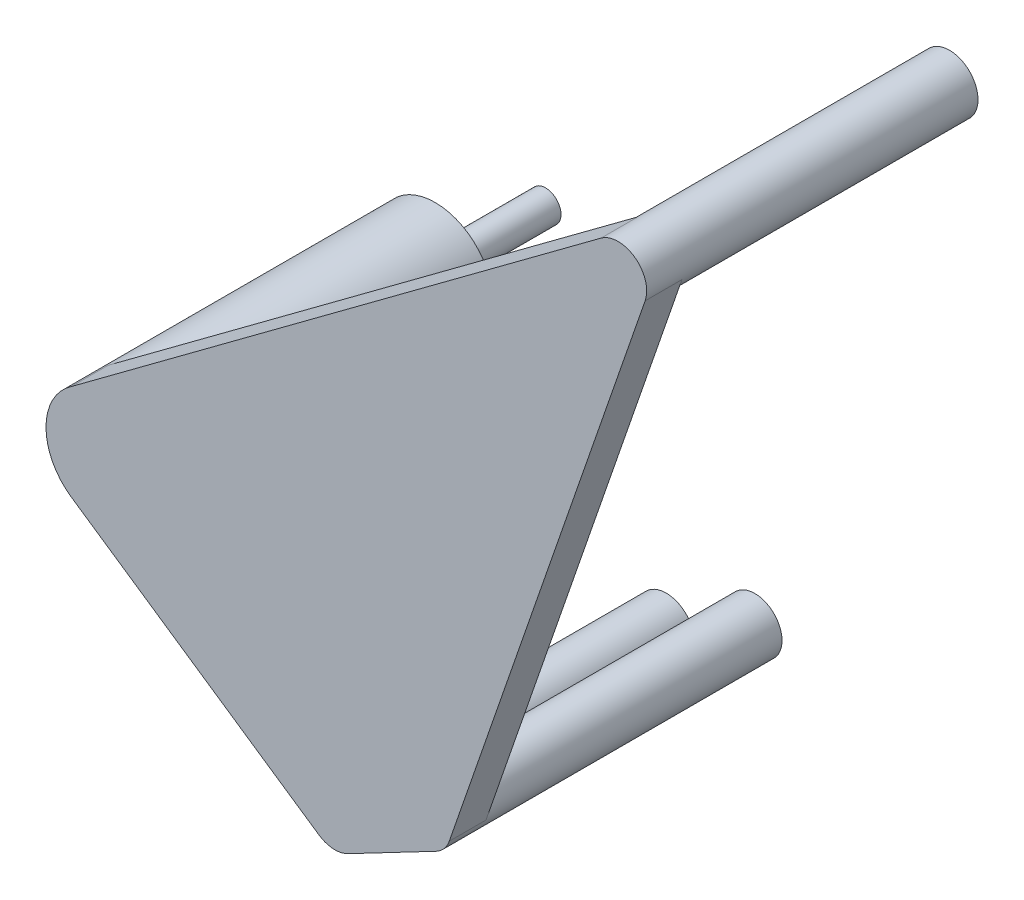
ISO-10303-21;
HEADER;
FILE_DESCRIPTION(('STEP AP214'),'2;1');
FILE_NAME('part.step','',(''),(''),'','','');
FILE_SCHEMA(('AUTOMOTIVE_DESIGN { 1 0 10303 214 1 1 1 1 }'));
ENDSEC;
DATA;
#1=APPLICATION_CONTEXT('core data for automotive mechanical design processes');
#2=APPLICATION_PROTOCOL_DEFINITION('international standard','automotive_design',2000,#1);
#3=PRODUCT_CONTEXT('',#1,'mechanical');
#4=PRODUCT('Part','Part','',(#3));
#5=PRODUCT_RELATED_PRODUCT_CATEGORY('part','',(#4));
#6=PRODUCT_DEFINITION_FORMATION('','',#4);
#7=PRODUCT_DEFINITION_CONTEXT('part definition',#1,'design');
#8=PRODUCT_DEFINITION('design','',#6,#7);
#9=PRODUCT_DEFINITION_SHAPE('','',#8);
#10=(LENGTH_UNIT() NAMED_UNIT(*) SI_UNIT(.MILLI.,.METRE.));
#11=(NAMED_UNIT(*) PLANE_ANGLE_UNIT() SI_UNIT($,.RADIAN.));
#12=(NAMED_UNIT(*) SI_UNIT($,.STERADIAN.) SOLID_ANGLE_UNIT());
#13=UNCERTAINTY_MEASURE_WITH_UNIT(LENGTH_MEASURE(1.E-05),#10,'distance_accuracy_value','');
#14=(GEOMETRIC_REPRESENTATION_CONTEXT(3) GLOBAL_UNCERTAINTY_ASSIGNED_CONTEXT((#13)) GLOBAL_UNIT_ASSIGNED_CONTEXT((#10,
#11,#12)) REPRESENTATION_CONTEXT('',''));
#15=CARTESIAN_POINT('',(0.,0.,0.));
#16=DIRECTION('',(0.,0.,1.));
#17=DIRECTION('',(1.,0.,0.));
#18=AXIS2_PLACEMENT_3D('',#15,#16,#17);
#19=CARTESIAN_POINT('',(0.,0.,35.7505));
#20=DIRECTION('',(0.,0.,1.));
#21=DIRECTION('',(1.,0.,0.));
#22=AXIS2_PLACEMENT_3D('',#19,#20,#21);
#23=PLANE('',#22);
#24=CARTESIAN_POINT('',(-2.84319901034025,123.138021162855,35.7505));
#25=DIRECTION('',(0.,0.,1.));
#26=DIRECTION('',(1.,0.,0.));
#27=AXIS2_PLACEMENT_3D('',#24,#25,#26);
#28=CIRCLE('',#27,7.40503170518328);
#29=CARTESIAN_POINT('',(4.15447512995117,120.715821505298,35.7505));
#30=VERTEX_POINT('',#29);
#31=CARTESIAN_POINT('',(-7.25833485906466,129.082856736029,35.7505));
#32=VERTEX_POINT('',#31);
#33=EDGE_CURVE('E45',#30,#32,#28,.F.);
#34=ORIENTED_EDGE('',*,*,#33,.F.);
#35=DIRECTION('',(0.327101861813902,0.944989085650136,0.));
#36=VECTOR('',#35,1.);
#37=CARTESIAN_POINT('',(-33.6042241942555,11.6318849240364,35.7505));
#38=LINE('',#37,#36);
#39=CARTESIAN_POINT('',(-46.5758038889972,-25.8426839065925,35.7505));
#40=VERTEX_POINT('',#39);
#41=EDGE_CURVE('E128',#40,#30,#38,.T.);
#42=ORIENTED_EDGE('',*,*,#41,.F.);
#43=CARTESIAN_POINT('',(-53.2361349334904,-23.5372533804274,35.7505));
#44=DIRECTION('',(0.,0.,1.));
#45=DIRECTION('',(1.,0.,0.));
#46=AXIS2_PLACEMENT_3D('',#43,#44,#45);
#47=CIRCLE('',#46,7.04805076125397);
#48=CARTESIAN_POINT('',(-49.9662161408965,-29.7808621624583,35.7505));
#49=VERTEX_POINT('',#48);
#50=EDGE_CURVE('E133',#49,#40,#47,.F.);
#51=ORIENTED_EDGE('',*,*,#50,.F.);
#52=DIRECTION('',(0.885863197290606,0.46394654399625,0.));
#53=VECTOR('',#52,1.);
#54=CARTESIAN_POINT('',(1.48468298043132,-2.83486541505193,35.7505));
#55=LINE('',#54,#53);
#56=CARTESIAN_POINT('',(-72.768932332621,-41.7231591257302,35.7505));
#57=VERTEX_POINT('',#56);
#58=EDGE_CURVE('E154',#57,#49,#55,.T.);
#59=ORIENTED_EDGE('',*,*,#58,.F.);
#60=CARTESIAN_POINT('',(-76.1757268505461,-35.2181987521369,35.7505));
#61=DIRECTION('',(0.,0.,1.));
#62=DIRECTION('',(1.,0.,0.));
#63=AXIS2_PLACEMENT_3D('',#60,#61,#62);
#64=CIRCLE('',#63,7.34307553749678);
#65=CARTESIAN_POINT('',(-80.3107623465941,-41.2863318913986,35.7505));
#66=VERTEX_POINT('',#65);
#67=EDGE_CURVE('E182',#66,#57,#64,.F.);
#68=ORIENTED_EDGE('',*,*,#67,.F.);
#69=DIRECTION('',(-0.826374876341027,0.563120381226211,0.));
#70=VECTOR('',#69,1.);
#71=CARTESIAN_POINT('',(-44.6794433362743,-65.5667432629609,35.7505));
#72=LINE('',#71,#70);
#73=CARTESIAN_POINT('',(-144.436770340403,2.41134467383935,35.7505));
#74=VERTEX_POINT('',#73);
#75=EDGE_CURVE('E142',#66,#74,#72,.T.);
#76=ORIENTED_EDGE('',*,*,#75,.T.);
#77=CARTESIAN_POINT('',(-135.98996462201,14.8069678189548,35.7505));
#78=DIRECTION('',(0.,0.,1.));
#79=DIRECTION('',(1.,0.,0.));
#80=AXIS2_PLACEMENT_3D('',#77,#78,#79);
#81=CIRCLE('',#80,15.);
#82=CARTESIAN_POINT('',(-144.436770340403,27.2025909640699,35.7505));
#83=VERTEX_POINT('',#82);
#84=EDGE_CURVE('E179',#74,#83,#81,.T.);
#85=ORIENTED_EDGE('',*,*,#84,.T.);
#86=DIRECTION('',(0.802810279531019,0.596234563808009,0.));
#87=VECTOR('',#86,1.);
#88=CARTESIAN_POINT('',(-64.3675245309122,86.6687600788286,35.7505));
#89=LINE('',#88,#87);
#90=EDGE_CURVE('E131',#83,#32,#89,.T.);
#91=ORIENTED_EDGE('',*,*,#90,.T.);
#92=EDGE_LOOP('',(#34,#42,#51,#59,#68,#76,#85,#91));
#93=FACE_BOUND('',#92,.T.);
#94=ADVANCED_FACE('F41',(#93),#23,.F.);
#95=CARTESIAN_POINT('',(-135.98996462201,14.8069678189548,40.513));
#96=DIRECTION('',(0.,0.,-1.));
#97=DIRECTION('',(-1.,0.,0.));
#98=AXIS2_PLACEMENT_3D('',#95,#96,#97);
#99=CYLINDRICAL_SURFACE('',#98,15.);
#100=ORIENTED_EDGE('',*,*,#84,.F.);
#101=DIRECTION('',(0.,0.,-1.));
#102=VECTOR('',#101,1.);
#103=CARTESIAN_POINT('',(-144.436770340403,2.41134467383935,45.2755));
#104=LINE('',#103,#102);
#105=CARTESIAN_POINT('',(-144.436770340403,2.41134467383935,45.2755));
#106=VERTEX_POINT('',#105);
#107=EDGE_CURVE('E66',#106,#74,#104,.T.);
#108=ORIENTED_EDGE('',*,*,#107,.F.);
#109=CARTESIAN_POINT('',(-135.98996462201,14.8069678189548,45.2755));
#110=DIRECTION('',(0.,0.,1.));
#111=DIRECTION('',(1.,0.,0.));
#112=AXIS2_PLACEMENT_3D('',#109,#110,#111);
#113=CIRCLE('',#112,15.);
#114=CARTESIAN_POINT('',(-144.436770340403,27.2025909640699,45.2755));
#115=VERTEX_POINT('',#114);
#116=EDGE_CURVE('E208',#115,#106,#113,.T.);
#117=ORIENTED_EDGE('',*,*,#116,.F.);
#118=DIRECTION('',(0.,0.,-1.));
#119=VECTOR('',#118,1.);
#120=CARTESIAN_POINT('',(-144.436770340403,27.2025909640699,45.2755));
#121=LINE('',#120,#119);
#122=EDGE_CURVE('E58',#115,#83,#121,.T.);
#123=ORIENTED_EDGE('',*,*,#122,.T.);
#124=EDGE_LOOP('',(#100,#108,#117,#123));
#125=FACE_BOUND('',#124,.T.);
#126=CARTESIAN_POINT('',(-135.98996462201,14.8069678189548,-40.513));
#127=DIRECTION('',(0.,0.,1.));
#128=DIRECTION('',(1.,0.,0.));
#129=AXIS2_PLACEMENT_3D('',#126,#127,#128);
#130=CIRCLE('',#129,15.);
#131=CARTESIAN_POINT('',(-120.98996462201,14.8069678189548,-40.513));
#132=VERTEX_POINT('',#131);
#133=EDGE_CURVE('E122',#132,#132,#130,.T.);
#134=ORIENTED_EDGE('',*,*,#133,.T.);
#135=EDGE_LOOP('',(#134));
#136=FACE_BOUND('',#135,.T.);
#137=ADVANCED_FACE('F43',(#125,#136),#99,.T.);
#138=CARTESIAN_POINT('',(0.,0.,-40.513));
#139=DIRECTION('',(0.,0.,1.));
#140=DIRECTION('',(1.,0.,0.));
#141=AXIS2_PLACEMENT_3D('',#138,#139,#140);
#142=PLANE('',#141);
#143=CARTESIAN_POINT('',(-135.98996462201,14.8069678189548,-40.513));
#144=DIRECTION('',(0.,0.,-1.));
#145=DIRECTION('',(-1.,0.,0.));
#146=AXIS2_PLACEMENT_3D('',#143,#144,#145);
#147=CIRCLE('',#146,3.99999999999999);
#148=CARTESIAN_POINT('',(-139.98996462201,14.8069678189548,-40.513));
#149=VERTEX_POINT('',#148);
#150=EDGE_CURVE('E11',#149,#149,#147,.T.);
#151=ORIENTED_EDGE('',*,*,#150,.F.);
#152=EDGE_LOOP('',(#151));
#153=FACE_BOUND('',#152,.T.);
#154=ORIENTED_EDGE('',*,*,#133,.F.);
#155=EDGE_LOOP('',(#154));
#156=FACE_BOUND('',#155,.T.);
#157=ADVANCED_FACE('F231',(#153,#156),#142,.F.);
#158=CARTESIAN_POINT('',(-33.6042241942555,11.6318849240364,45.2755));
#159=DIRECTION('',(-0.944989085650135,0.327101861813902,0.));
#160=DIRECTION('',(-0.327101861813902,-0.944989085650136,0.));
#161=AXIS2_PLACEMENT_3D('',#158,#159,#160);
#162=PLANE('',#161);
#163=ORIENTED_EDGE('',*,*,#41,.T.);
#164=DIRECTION('',(0.,0.,-1.));
#165=VECTOR('',#164,1.);
#166=CARTESIAN_POINT('',(4.15447512995117,120.715821505298,45.2755));
#167=LINE('',#166,#165);
#168=CARTESIAN_POINT('',(4.15447512995117,120.715821505298,45.2755));
#169=VERTEX_POINT('',#168);
#170=EDGE_CURVE('E110',#169,#30,#167,.T.);
#171=ORIENTED_EDGE('',*,*,#170,.F.);
#172=DIRECTION('',(0.327101861813902,0.944989085650136,0.));
#173=VECTOR('',#172,1.);
#174=CARTESIAN_POINT('',(-33.6042241942555,11.6318849240364,45.2755));
#175=LINE('',#174,#173);
#176=CARTESIAN_POINT('',(-46.5758038889972,-25.8426839065925,45.2755));
#177=VERTEX_POINT('',#176);
#178=EDGE_CURVE('E158',#177,#169,#175,.T.);
#179=ORIENTED_EDGE('',*,*,#178,.F.);
#180=DIRECTION('',(0.,0.,-1.));
#181=VECTOR('',#180,1.);
#182=CARTESIAN_POINT('',(-46.5758038889972,-25.8426839065925,45.2755));
#183=LINE('',#182,#181);
#184=EDGE_CURVE('E136',#177,#40,#183,.T.);
#185=ORIENTED_EDGE('',*,*,#184,.T.);
#186=EDGE_LOOP('',(#163,#171,#179,#185));
#187=FACE_BOUND('',#186,.T.);
#188=ADVANCED_FACE('F134',(#187),#162,.F.);
#189=CARTESIAN_POINT('',(-2.84319901034025,123.138021162855,45.2755));
#190=DIRECTION('',(0.,0.,-1.));
#191=DIRECTION('',(-1.,0.,0.));
#192=AXIS2_PLACEMENT_3D('',#189,#190,#191);
#193=CYLINDRICAL_SURFACE('',#192,7.40503170518327);
#194=ORIENTED_EDGE('',*,*,#170,.T.);
#195=ORIENTED_EDGE('',*,*,#33,.T.);
#196=DIRECTION('',(0.,0.,-1.));
#197=VECTOR('',#196,1.);
#198=CARTESIAN_POINT('',(-7.25833485906466,129.082856736029,45.2755));
#199=LINE('',#198,#197);
#200=CARTESIAN_POINT('',(-7.25833485906466,129.082856736029,45.2755));
#201=VERTEX_POINT('',#200);
#202=EDGE_CURVE('E123',#201,#32,#199,.T.);
#203=ORIENTED_EDGE('',*,*,#202,.F.);
#204=CARTESIAN_POINT('',(-2.84319901034025,123.138021162855,45.2755));
#205=DIRECTION('',(0.,0.,1.));
#206=DIRECTION('',(1.,0.,0.));
#207=AXIS2_PLACEMENT_3D('',#204,#205,#206);
#208=CIRCLE('',#207,7.40503170518327);
#209=EDGE_CURVE('E116',#169,#201,#208,.T.);
#210=ORIENTED_EDGE('',*,*,#209,.F.);
#211=EDGE_LOOP('',(#194,#195,#203,#210));
#212=FACE_BOUND('',#211,.T.);
#213=CARTESIAN_POINT('',(-2.84319901034025,123.138021162855,-40.513));
#214=DIRECTION('',(0.,0.,1.));
#215=DIRECTION('',(1.,0.,0.));
#216=AXIS2_PLACEMENT_3D('',#213,#214,#215);
#217=CIRCLE('',#216,7.40503170518328);
#218=CARTESIAN_POINT('',(4.56183269484303,123.138021162855,-40.513));
#219=VERTEX_POINT('',#218);
#220=EDGE_CURVE('E497',#219,#219,#217,.T.);
#221=ORIENTED_EDGE('',*,*,#220,.T.);
#222=EDGE_LOOP('',(#221));
#223=FACE_BOUND('',#222,.T.);
#224=ADVANCED_FACE('F112',(#212,#223),#193,.T.);
#225=CARTESIAN_POINT('',(-64.3675245309122,86.6687600788286,45.2755));
#226=DIRECTION('',(-0.596234563808009,0.802810279531019,0.));
#227=DIRECTION('',(-0.802810279531019,-0.596234563808009,0.));
#228=AXIS2_PLACEMENT_3D('',#225,#226,#227);
#229=PLANE('',#228);
#230=ORIENTED_EDGE('',*,*,#90,.F.);
#231=ORIENTED_EDGE('',*,*,#122,.F.);
#232=DIRECTION('',(0.802810279531019,0.596234563808009,0.));
#233=VECTOR('',#232,1.);
#234=CARTESIAN_POINT('',(-64.3675245309122,86.6687600788286,45.2755));
#235=LINE('',#234,#233);
#236=EDGE_CURVE('E213',#115,#201,#235,.T.);
#237=ORIENTED_EDGE('',*,*,#236,.T.);
#238=ORIENTED_EDGE('',*,*,#202,.T.);
#239=EDGE_LOOP('',(#230,#231,#237,#238));
#240=FACE_BOUND('',#239,.T.);
#241=ADVANCED_FACE('F228',(#240),#229,.T.);
#242=CARTESIAN_POINT('',(-44.6794433362743,-65.5667432629609,45.2755));
#243=DIRECTION('',(-0.563120381226211,-0.826374876341027,0.));
#244=DIRECTION('',(0.826374876341027,-0.563120381226211,0.));
#245=AXIS2_PLACEMENT_3D('',#242,#243,#244);
#246=PLANE('',#245);
#247=ORIENTED_EDGE('',*,*,#75,.F.);
#248=DIRECTION('',(0.,0.,-1.));
#249=VECTOR('',#248,1.);
#250=CARTESIAN_POINT('',(-80.3107623465941,-41.2863318913986,45.2755));
#251=LINE('',#250,#249);
#252=CARTESIAN_POINT('',(-80.3107623465941,-41.2863318913986,45.2755));
#253=VERTEX_POINT('',#252);
#254=EDGE_CURVE('E167',#253,#66,#251,.T.);
#255=ORIENTED_EDGE('',*,*,#254,.F.);
#256=DIRECTION('',(-0.826374876341027,0.563120381226211,0.));
#257=VECTOR('',#256,1.);
#258=CARTESIAN_POINT('',(-44.6794433362743,-65.5667432629609,45.2755));
#259=LINE('',#258,#257);
#260=EDGE_CURVE('E205',#253,#106,#259,.T.);
#261=ORIENTED_EDGE('',*,*,#260,.T.);
#262=ORIENTED_EDGE('',*,*,#107,.T.);
#263=EDGE_LOOP('',(#247,#255,#261,#262));
#264=FACE_BOUND('',#263,.T.);
#265=ADVANCED_FACE('F204',(#264),#246,.T.);
#266=CARTESIAN_POINT('',(-76.1757268505461,-35.2181987521369,45.2755));
#267=DIRECTION('',(0.,0.,-1.));
#268=DIRECTION('',(-1.,0.,0.));
#269=AXIS2_PLACEMENT_3D('',#266,#267,#268);
#270=CYLINDRICAL_SURFACE('',#269,7.3430755374968);
#271=ORIENTED_EDGE('',*,*,#254,.T.);
#272=ORIENTED_EDGE('',*,*,#67,.T.);
#273=DIRECTION('',(0.,0.,-1.));
#274=VECTOR('',#273,1.);
#275=CARTESIAN_POINT('',(-72.768932332621,-41.7231591257302,45.2755));
#276=LINE('',#275,#274);
#277=CARTESIAN_POINT('',(-72.768932332621,-41.7231591257302,45.2755));
#278=VERTEX_POINT('',#277);
#279=EDGE_CURVE('E164',#278,#57,#276,.T.);
#280=ORIENTED_EDGE('',*,*,#279,.F.);
#281=CARTESIAN_POINT('',(-76.1757268505461,-35.2181987521369,45.2755));
#282=DIRECTION('',(0.,0.,1.));
#283=DIRECTION('',(1.,0.,0.));
#284=AXIS2_PLACEMENT_3D('',#281,#282,#283);
#285=CIRCLE('',#284,7.3430755374968);
#286=EDGE_CURVE('E202',#253,#278,#285,.T.);
#287=ORIENTED_EDGE('',*,*,#286,.F.);
#288=EDGE_LOOP('',(#271,#272,#280,#287));
#289=FACE_BOUND('',#288,.T.);
#290=CARTESIAN_POINT('',(-76.1757268505461,-35.2181987521369,-40.513));
#291=DIRECTION('',(0.,0.,1.));
#292=DIRECTION('',(1.,0.,0.));
#293=AXIS2_PLACEMENT_3D('',#290,#291,#292);
#294=CIRCLE('',#293,7.34307553749678);
#295=CARTESIAN_POINT('',(-68.8326513130493,-35.2181987521369,-40.513));
#296=VERTEX_POINT('',#295);
#297=EDGE_CURVE('E138',#296,#296,#294,.T.);
#298=ORIENTED_EDGE('',*,*,#297,.T.);
#299=EDGE_LOOP('',(#298));
#300=FACE_BOUND('',#299,.T.);
#301=ADVANCED_FACE('F200',(#289,#300),#270,.T.);
#302=CARTESIAN_POINT('',(1.48468298043132,-2.83486541505193,45.2755));
#303=DIRECTION('',(-0.46394654399625,0.885863197290606,0.));
#304=DIRECTION('',(-0.885863197290606,-0.46394654399625,0.));
#305=AXIS2_PLACEMENT_3D('',#302,#303,#304);
#306=PLANE('',#305);
#307=ORIENTED_EDGE('',*,*,#58,.T.);
#308=DIRECTION('',(0.,0.,-1.));
#309=VECTOR('',#308,1.);
#310=CARTESIAN_POINT('',(-49.9662161408965,-29.7808621624583,45.2755));
#311=LINE('',#310,#309);
#312=CARTESIAN_POINT('',(-49.9662161408965,-29.7808621624583,45.2755));
#313=VERTEX_POINT('',#312);
#314=EDGE_CURVE('E161',#313,#49,#311,.T.);
#315=ORIENTED_EDGE('',*,*,#314,.F.);
#316=DIRECTION('',(0.885863197290606,0.46394654399625,0.));
#317=VECTOR('',#316,1.);
#318=CARTESIAN_POINT('',(1.48468298043132,-2.83486541505193,45.2755));
#319=LINE('',#318,#317);
#320=EDGE_CURVE('E197',#278,#313,#319,.T.);
#321=ORIENTED_EDGE('',*,*,#320,.F.);
#322=ORIENTED_EDGE('',*,*,#279,.T.);
#323=EDGE_LOOP('',(#307,#315,#321,#322));
#324=FACE_BOUND('',#323,.T.);
#325=ADVANCED_FACE('F194',(#324),#306,.F.);
#326=CARTESIAN_POINT('',(-53.2361349334904,-23.5372533804274,45.2755));
#327=DIRECTION('',(0.,0.,-1.));
#328=DIRECTION('',(-1.,0.,0.));
#329=AXIS2_PLACEMENT_3D('',#326,#327,#328);
#330=CYLINDRICAL_SURFACE('',#329,7.04805076125397);
#331=ORIENTED_EDGE('',*,*,#314,.T.);
#332=ORIENTED_EDGE('',*,*,#50,.T.);
#333=ORIENTED_EDGE('',*,*,#184,.F.);
#334=CARTESIAN_POINT('',(-53.2361349334904,-23.5372533804274,45.2755));
#335=DIRECTION('',(0.,0.,1.));
#336=DIRECTION('',(1.,0.,0.));
#337=AXIS2_PLACEMENT_3D('',#334,#335,#336);
#338=CIRCLE('',#337,7.04805076125397);
#339=EDGE_CURVE('E148',#313,#177,#338,.T.);
#340=ORIENTED_EDGE('',*,*,#339,.F.);
#341=EDGE_LOOP('',(#331,#332,#333,#340));
#342=FACE_BOUND('',#341,.T.);
#343=CARTESIAN_POINT('',(-53.2361349334904,-23.5372533804274,-40.513));
#344=DIRECTION('',(0.,0.,1.));
#345=DIRECTION('',(1.,0.,0.));
#346=AXIS2_PLACEMENT_3D('',#343,#344,#345);
#347=CIRCLE('',#346,7.04805076125397);
#348=CARTESIAN_POINT('',(-46.1880841722364,-23.5372533804274,-40.513));
#349=VERTEX_POINT('',#348);
#350=EDGE_CURVE('E145',#349,#349,#347,.T.);
#351=ORIENTED_EDGE('',*,*,#350,.T.);
#352=EDGE_LOOP('',(#351));
#353=FACE_BOUND('',#352,.T.);
#354=ADVANCED_FACE('F187',(#342,#353),#330,.T.);
#355=CARTESIAN_POINT('',(0.,0.,45.2755));
#356=DIRECTION('',(0.,0.,1.));
#357=DIRECTION('',(1.,0.,0.));
#358=AXIS2_PLACEMENT_3D('',#355,#356,#357);
#359=PLANE('',#358);
#360=ORIENTED_EDGE('',*,*,#178,.T.);
#361=ORIENTED_EDGE('',*,*,#209,.T.);
#362=ORIENTED_EDGE('',*,*,#236,.F.);
#363=ORIENTED_EDGE('',*,*,#116,.T.);
#364=ORIENTED_EDGE('',*,*,#260,.F.);
#365=ORIENTED_EDGE('',*,*,#286,.T.);
#366=ORIENTED_EDGE('',*,*,#320,.T.);
#367=ORIENTED_EDGE('',*,*,#339,.T.);
#368=EDGE_LOOP('',(#360,#361,#362,#363,#364,#365,#366,#367));
#369=FACE_BOUND('',#368,.T.);
#370=ADVANCED_FACE('F218',(#369),#359,.T.);
#371=CARTESIAN_POINT('',(0.,0.,-40.513));
#372=DIRECTION('',(0.,0.,1.));
#373=DIRECTION('',(1.,0.,0.));
#374=AXIS2_PLACEMENT_3D('',#371,#372,#373);
#375=PLANE('',#374);
#376=CARTESIAN_POINT('',(-76.1757268505461,-35.2181987521369,-40.513));
#377=DIRECTION('',(0.,0.,-1.));
#378=DIRECTION('',(-1.,0.,0.));
#379=AXIS2_PLACEMENT_3D('',#376,#377,#378);
#380=CIRCLE('',#379,1.26999999999999);
#381=CARTESIAN_POINT('',(-77.4457268505461,-35.2181987521369,-40.513));
#382=VERTEX_POINT('',#381);
#383=EDGE_CURVE('E486',#382,#382,#380,.T.);
#384=ORIENTED_EDGE('',*,*,#383,.F.);
#385=EDGE_LOOP('',(#384));
#386=FACE_BOUND('',#385,.T.);
#387=ORIENTED_EDGE('',*,*,#297,.F.);
#388=EDGE_LOOP('',(#387));
#389=FACE_BOUND('',#388,.T.);
#390=ADVANCED_FACE('F289',(#386,#389),#375,.F.);
#391=CARTESIAN_POINT('',(0.,0.,-40.513));
#392=DIRECTION('',(0.,0.,1.));
#393=DIRECTION('',(1.,0.,0.));
#394=AXIS2_PLACEMENT_3D('',#391,#392,#393);
#395=PLANE('',#394);
#396=CARTESIAN_POINT('',(-53.2361349334904,-23.5372533804274,-40.513));
#397=DIRECTION('',(0.,0.,-1.));
#398=DIRECTION('',(-1.,0.,0.));
#399=AXIS2_PLACEMENT_3D('',#396,#397,#398);
#400=CIRCLE('',#399,1.27);
#401=CARTESIAN_POINT('',(-54.5061349334904,-23.5372533804274,-40.513));
#402=VERTEX_POINT('',#401);
#403=EDGE_CURVE('E485',#402,#402,#400,.T.);
#404=ORIENTED_EDGE('',*,*,#403,.F.);
#405=EDGE_LOOP('',(#404));
#406=FACE_BOUND('',#405,.T.);
#407=ORIENTED_EDGE('',*,*,#350,.F.);
#408=EDGE_LOOP('',(#407));
#409=FACE_BOUND('',#408,.T.);
#410=ADVANCED_FACE('F295',(#406,#409),#395,.F.);
#411=CARTESIAN_POINT('',(0.,0.,-40.513));
#412=DIRECTION('',(0.,0.,1.));
#413=DIRECTION('',(1.,0.,0.));
#414=AXIS2_PLACEMENT_3D('',#411,#412,#413);
#415=PLANE('',#414);
#416=CARTESIAN_POINT('',(-2.84319901034025,123.138021162855,-40.513));
#417=DIRECTION('',(0.,0.,-1.));
#418=DIRECTION('',(-1.,0.,0.));
#419=AXIS2_PLACEMENT_3D('',#416,#417,#418);
#420=CIRCLE('',#419,1.27);
#421=CARTESIAN_POINT('',(-4.11319901034025,123.138021162855,-40.513));
#422=VERTEX_POINT('',#421);
#423=EDGE_CURVE('E474',#422,#422,#420,.T.);
#424=ORIENTED_EDGE('',*,*,#423,.F.);
#425=EDGE_LOOP('',(#424));
#426=FACE_BOUND('',#425,.T.);
#427=ORIENTED_EDGE('',*,*,#220,.F.);
#428=EDGE_LOOP('',(#427));
#429=FACE_BOUND('',#428,.T.);
#430=ADVANCED_FACE('F302',(#426,#429),#415,.F.);
#431=CARTESIAN_POINT('',(-2.84319901034025,123.138021162855,-30.988));
#432=DIRECTION('',(0.,0.,-1.));
#433=DIRECTION('',(-1.,0.,0.));
#434=AXIS2_PLACEMENT_3D('',#431,#432,#433);
#435=CYLINDRICAL_SURFACE('',#434,1.27);
#436=CARTESIAN_POINT('',(-2.84319901034025,123.138021162855,-30.988));
#437=DIRECTION('',(0.,0.,-1.));
#438=DIRECTION('',(-1.,0.,0.));
#439=AXIS2_PLACEMENT_3D('',#436,#437,#438);
#440=CIRCLE('',#439,1.27);
#441=CARTESIAN_POINT('',(-4.11319901034025,123.138021162855,-30.988));
#442=VERTEX_POINT('',#441);
#443=EDGE_CURVE('E478',#442,#442,#440,.T.);
#444=CARTESIAN_POINT('',(-4.11319901034025,123.138021162855,-30.988));
#445=CARTESIAN_POINT('',(-4.11319901034025,123.138021162855,-31.08721875));
#446=CARTESIAN_POINT('',(-4.11319901034025,123.138021162855,-31.1864375));
#447=CARTESIAN_POINT('',(-4.11319901034025,123.138021162855,-31.384875));
#448=CARTESIAN_POINT('',(-4.11319901034025,123.138021162855,-31.48409375));
#449=CARTESIAN_POINT('',(-4.11319901034025,123.138021162855,-31.68253125));
#450=CARTESIAN_POINT('',(-4.11319901034025,123.138021162855,-31.78175));
#451=CARTESIAN_POINT('',(-4.11319901034025,123.138021162855,-31.9801875));
#452=CARTESIAN_POINT('',(-4.11319901034025,123.138021162855,-32.07940625));
#453=CARTESIAN_POINT('',(-4.11319901034025,123.138021162855,-32.27784375));
#454=CARTESIAN_POINT('',(-4.11319901034025,123.138021162855,-32.3770625));
#455=CARTESIAN_POINT('',(-4.11319901034025,123.138021162855,-32.5755));
#456=CARTESIAN_POINT('',(-4.11319901034025,123.138021162855,-32.67471875));
#457=CARTESIAN_POINT('',(-4.11319901034025,123.138021162855,-32.87315625));
#458=CARTESIAN_POINT('',(-4.11319901034025,123.138021162855,-32.972375));
#459=CARTESIAN_POINT('',(-4.11319901034025,123.138021162855,-33.1708125));
#460=CARTESIAN_POINT('',(-4.11319901034025,123.138021162855,-33.27003125));
#461=CARTESIAN_POINT('',(-4.11319901034025,123.138021162855,-33.46846875));
#462=CARTESIAN_POINT('',(-4.11319901034025,123.138021162855,-33.5676875));
#463=CARTESIAN_POINT('',(-4.11319901034025,123.138021162855,-33.766125));
#464=CARTESIAN_POINT('',(-4.11319901034025,123.138021162855,-33.86534375));
#465=CARTESIAN_POINT('',(-4.11319901034025,123.138021162855,-34.06378125));
#466=CARTESIAN_POINT('',(-4.11319901034025,123.138021162855,-34.163));
#467=CARTESIAN_POINT('',(-4.11319901034025,123.138021162855,-34.3614375));
#468=CARTESIAN_POINT('',(-4.11319901034025,123.138021162855,-34.46065625));
#469=CARTESIAN_POINT('',(-4.11319901034025,123.138021162855,-34.65909375));
#470=CARTESIAN_POINT('',(-4.11319901034025,123.138021162855,-34.7583125));
#471=CARTESIAN_POINT('',(-4.11319901034025,123.138021162855,-34.95675));
#472=CARTESIAN_POINT('',(-4.11319901034025,123.138021162855,-35.05596875));
#473=CARTESIAN_POINT('',(-4.11319901034025,123.138021162855,-35.25440625));
#474=CARTESIAN_POINT('',(-4.11319901034025,123.138021162855,-35.353625));
#475=CARTESIAN_POINT('',(-4.11319901034025,123.138021162855,-35.5520625));
#476=CARTESIAN_POINT('',(-4.11319901034025,123.138021162855,-35.65128125));
#477=CARTESIAN_POINT('',(-4.11319901034025,123.138021162855,-35.84971875));
#478=CARTESIAN_POINT('',(-4.11319901034025,123.138021162855,-35.9489375));
#479=CARTESIAN_POINT('',(-4.11319901034025,123.138021162855,-36.147375));
#480=CARTESIAN_POINT('',(-4.11319901034025,123.138021162855,-36.24659375));
#481=CARTESIAN_POINT('',(-4.11319901034025,123.138021162855,-36.44503125));
#482=CARTESIAN_POINT('',(-4.11319901034025,123.138021162855,-36.54425));
#483=CARTESIAN_POINT('',(-4.11319901034025,123.138021162855,-36.7426875));
#484=CARTESIAN_POINT('',(-4.11319901034025,123.138021162855,-36.84190625));
#485=CARTESIAN_POINT('',(-4.11319901034025,123.138021162855,-37.04034375));
#486=CARTESIAN_POINT('',(-4.11319901034025,123.138021162855,-37.1395625));
#487=CARTESIAN_POINT('',(-4.11319901034025,123.138021162855,-37.338));
#488=CARTESIAN_POINT('',(-4.11319901034025,123.138021162855,-37.43721875));
#489=CARTESIAN_POINT('',(-4.11319901034025,123.138021162855,-37.63565625));
#490=CARTESIAN_POINT('',(-4.11319901034025,123.138021162855,-37.734875));
#491=CARTESIAN_POINT('',(-4.11319901034025,123.138021162855,-37.9333125));
#492=CARTESIAN_POINT('',(-4.11319901034025,123.138021162855,-38.03253125));
#493=CARTESIAN_POINT('',(-4.11319901034025,123.138021162855,-38.23096875));
#494=CARTESIAN_POINT('',(-4.11319901034025,123.138021162855,-38.3301875));
#495=CARTESIAN_POINT('',(-4.11319901034025,123.138021162855,-38.528625));
#496=CARTESIAN_POINT('',(-4.11319901034025,123.138021162855,-38.62784375));
#497=CARTESIAN_POINT('',(-4.11319901034025,123.138021162855,-38.82628125));
#498=CARTESIAN_POINT('',(-4.11319901034025,123.138021162855,-38.9255));
#499=CARTESIAN_POINT('',(-4.11319901034025,123.138021162855,-39.1239375));
#500=CARTESIAN_POINT('',(-4.11319901034025,123.138021162855,-39.22315625));
#501=CARTESIAN_POINT('',(-4.11319901034025,123.138021162855,-39.42159375));
#502=CARTESIAN_POINT('',(-4.11319901034025,123.138021162855,-39.5208125));
#503=CARTESIAN_POINT('',(-4.11319901034025,123.138021162855,-39.71925));
#504=CARTESIAN_POINT('',(-4.11319901034025,123.138021162855,-39.81846875));
#505=CARTESIAN_POINT('',(-4.11319901034025,123.138021162855,-40.01690625));
#506=CARTESIAN_POINT('',(-4.11319901034025,123.138021162855,-40.116125));
#507=CARTESIAN_POINT('',(-4.11319901034025,123.138021162855,-40.3145625));
#508=CARTESIAN_POINT('',(-4.11319901034025,123.138021162855,-40.41378125));
#509=CARTESIAN_POINT('',(-4.11319901034025,123.138021162855,-40.513));
#510=B_SPLINE_CURVE_WITH_KNOTS('',3,(#444,#445,#446,#447,#448,#449,#450,#451,#452,#453,#454,
#455,#456,#457,#458,#459,#460,#461,#462,#463,#464,#465,#466,#467,#468,#469,#470,#471,#472,#473,
#474,#475,#476,#477,#478,#479,#480,#481,#482,#483,#484,#485,#486,#487,#488,#489,#490,#491,#492,
#493,#494,#495,#496,#497,#498,#499,#500,#501,#502,#503,#504,#505,#506,#507,#508,#509),
.UNSPECIFIED.,.F.,.F.,(4,2,2,2,2,2,2,2,2,2,2,2,2,2,2,2,2,2,2,2,2,2,2,2,2,2,2,2,2,2,2,2,4),(0.,
0.297656250000004,0.595312500000004,0.892968750000004,1.190625,1.48828125,1.7859375,2.08359375,
2.38125,2.67890625000001,2.9765625,3.27421875,3.571875,3.86953125,4.1671875,4.46484375,4.7625,
5.06015625,5.3578125,5.65546875,5.953125,6.25078125,6.5484375,6.84609375,7.14375,7.44140625,
7.7390625,8.03671875,8.334375,8.63203125,8.9296875,9.22734375,9.525),.UNSPECIFIED.);
#511=EDGE_CURVE('BSEAM310',#442,#422,#510,.T.);
#512=ORIENTED_EDGE('',*,*,#443,.F.);
#513=ORIENTED_EDGE('',*,*,#423,.T.);
#514=ORIENTED_EDGE('',*,*,#511,.T.);
#515=ORIENTED_EDGE('',*,*,#511,.F.);
#516=EDGE_LOOP('',(#512,#514,#513,#515));
#517=FACE_BOUND('',#516,.T.);
#518=ADVANCED_FACE('F310',(#517),#435,.F.);
#519=CARTESIAN_POINT('',(-2.84319901034025,123.138021162855,-30.988));
#520=DIRECTION('',(0.,0.,-1.));
#521=DIRECTION('',(-1.,0.,0.));
#522=AXIS2_PLACEMENT_3D('',#519,#520,#521);
#523=PLANE('',#522);
#524=ORIENTED_EDGE('',*,*,#443,.T.);
#525=EDGE_LOOP('',(#524));
#526=FACE_BOUND('',#525,.T.);
#527=ADVANCED_FACE('F318',(#526),#523,.T.);
#528=CARTESIAN_POINT('',(-53.2361349334904,-23.5372533804274,-30.988));
#529=DIRECTION('',(0.,0.,-1.));
#530=DIRECTION('',(-1.,0.,0.));
#531=AXIS2_PLACEMENT_3D('',#528,#529,#530);
#532=CYLINDRICAL_SURFACE('',#531,1.27);
#533=CARTESIAN_POINT('',(-53.2361349334904,-23.5372533804274,-30.988));
#534=DIRECTION('',(0.,0.,-1.));
#535=DIRECTION('',(-1.,0.,0.));
#536=AXIS2_PLACEMENT_3D('',#533,#534,#535);
#537=CIRCLE('',#536,1.27);
#538=CARTESIAN_POINT('',(-54.5061349334904,-23.5372533804274,-30.988));
#539=VERTEX_POINT('',#538);
#540=EDGE_CURVE('E493',#539,#539,#537,.T.);
#541=CARTESIAN_POINT('',(-54.5061349334904,-23.5372533804274,-30.988));
#542=CARTESIAN_POINT('',(-54.5061349334904,-23.5372533804274,-31.08721875));
#543=CARTESIAN_POINT('',(-54.5061349334904,-23.5372533804274,-31.1864375));
#544=CARTESIAN_POINT('',(-54.5061349334904,-23.5372533804274,-31.384875));
#545=CARTESIAN_POINT('',(-54.5061349334904,-23.5372533804274,-31.48409375));
#546=CARTESIAN_POINT('',(-54.5061349334904,-23.5372533804274,-31.68253125));
#547=CARTESIAN_POINT('',(-54.5061349334904,-23.5372533804274,-31.78175));
#548=CARTESIAN_POINT('',(-54.5061349334904,-23.5372533804274,-31.9801875));
#549=CARTESIAN_POINT('',(-54.5061349334904,-23.5372533804274,-32.07940625));
#550=CARTESIAN_POINT('',(-54.5061349334904,-23.5372533804274,-32.27784375));
#551=CARTESIAN_POINT('',(-54.5061349334904,-23.5372533804274,-32.3770625));
#552=CARTESIAN_POINT('',(-54.5061349334904,-23.5372533804274,-32.5755));
#553=CARTESIAN_POINT('',(-54.5061349334904,-23.5372533804274,-32.67471875));
#554=CARTESIAN_POINT('',(-54.5061349334904,-23.5372533804274,-32.87315625));
#555=CARTESIAN_POINT('',(-54.5061349334904,-23.5372533804274,-32.972375));
#556=CARTESIAN_POINT('',(-54.5061349334904,-23.5372533804274,-33.1708125));
#557=CARTESIAN_POINT('',(-54.5061349334904,-23.5372533804274,-33.27003125));
#558=CARTESIAN_POINT('',(-54.5061349334904,-23.5372533804274,-33.46846875));
#559=CARTESIAN_POINT('',(-54.5061349334904,-23.5372533804274,-33.5676875));
#560=CARTESIAN_POINT('',(-54.5061349334904,-23.5372533804274,-33.766125));
#561=CARTESIAN_POINT('',(-54.5061349334904,-23.5372533804274,-33.86534375));
#562=CARTESIAN_POINT('',(-54.5061349334904,-23.5372533804274,-34.06378125));
#563=CARTESIAN_POINT('',(-54.5061349334904,-23.5372533804274,-34.163));
#564=CARTESIAN_POINT('',(-54.5061349334904,-23.5372533804274,-34.3614375));
#565=CARTESIAN_POINT('',(-54.5061349334904,-23.5372533804274,-34.46065625));
#566=CARTESIAN_POINT('',(-54.5061349334904,-23.5372533804274,-34.65909375));
#567=CARTESIAN_POINT('',(-54.5061349334904,-23.5372533804274,-34.7583125));
#568=CARTESIAN_POINT('',(-54.5061349334904,-23.5372533804274,-34.95675));
#569=CARTESIAN_POINT('',(-54.5061349334904,-23.5372533804274,-35.05596875));
#570=CARTESIAN_POINT('',(-54.5061349334904,-23.5372533804274,-35.25440625));
#571=CARTESIAN_POINT('',(-54.5061349334904,-23.5372533804274,-35.353625));
#572=CARTESIAN_POINT('',(-54.5061349334904,-23.5372533804274,-35.5520625));
#573=CARTESIAN_POINT('',(-54.5061349334904,-23.5372533804274,-35.65128125));
#574=CARTESIAN_POINT('',(-54.5061349334904,-23.5372533804274,-35.84971875));
#575=CARTESIAN_POINT('',(-54.5061349334904,-23.5372533804274,-35.9489375));
#576=CARTESIAN_POINT('',(-54.5061349334904,-23.5372533804274,-36.147375));
#577=CARTESIAN_POINT('',(-54.5061349334904,-23.5372533804274,-36.24659375));
#578=CARTESIAN_POINT('',(-54.5061349334904,-23.5372533804274,-36.44503125));
#579=CARTESIAN_POINT('',(-54.5061349334904,-23.5372533804274,-36.54425));
#580=CARTESIAN_POINT('',(-54.5061349334904,-23.5372533804274,-36.7426875));
#581=CARTESIAN_POINT('',(-54.5061349334904,-23.5372533804274,-36.84190625));
#582=CARTESIAN_POINT('',(-54.5061349334904,-23.5372533804274,-37.04034375));
#583=CARTESIAN_POINT('',(-54.5061349334904,-23.5372533804274,-37.1395625));
#584=CARTESIAN_POINT('',(-54.5061349334904,-23.5372533804274,-37.338));
#585=CARTESIAN_POINT('',(-54.5061349334904,-23.5372533804274,-37.43721875));
#586=CARTESIAN_POINT('',(-54.5061349334904,-23.5372533804274,-37.63565625));
#587=CARTESIAN_POINT('',(-54.5061349334904,-23.5372533804274,-37.734875));
#588=CARTESIAN_POINT('',(-54.5061349334904,-23.5372533804274,-37.9333125));
#589=CARTESIAN_POINT('',(-54.5061349334904,-23.5372533804274,-38.03253125));
#590=CARTESIAN_POINT('',(-54.5061349334904,-23.5372533804274,-38.23096875));
#591=CARTESIAN_POINT('',(-54.5061349334904,-23.5372533804274,-38.3301875));
#592=CARTESIAN_POINT('',(-54.5061349334904,-23.5372533804274,-38.528625));
#593=CARTESIAN_POINT('',(-54.5061349334904,-23.5372533804274,-38.62784375));
#594=CARTESIAN_POINT('',(-54.5061349334904,-23.5372533804274,-38.82628125));
#595=CARTESIAN_POINT('',(-54.5061349334904,-23.5372533804274,-38.9255));
#596=CARTESIAN_POINT('',(-54.5061349334904,-23.5372533804274,-39.1239375));
#597=CARTESIAN_POINT('',(-54.5061349334904,-23.5372533804274,-39.22315625));
#598=CARTESIAN_POINT('',(-54.5061349334904,-23.5372533804274,-39.42159375));
#599=CARTESIAN_POINT('',(-54.5061349334904,-23.5372533804274,-39.5208125));
#600=CARTESIAN_POINT('',(-54.5061349334904,-23.5372533804274,-39.71925));
#601=CARTESIAN_POINT('',(-54.5061349334904,-23.5372533804274,-39.81846875));
#602=CARTESIAN_POINT('',(-54.5061349334904,-23.5372533804274,-40.01690625));
#603=CARTESIAN_POINT('',(-54.5061349334904,-23.5372533804274,-40.116125));
#604=CARTESIAN_POINT('',(-54.5061349334904,-23.5372533804274,-40.3145625));
#605=CARTESIAN_POINT('',(-54.5061349334904,-23.5372533804274,-40.41378125));
#606=CARTESIAN_POINT('',(-54.5061349334904,-23.5372533804274,-40.513));
#607=B_SPLINE_CURVE_WITH_KNOTS('',3,(#541,#542,#543,#544,#545,#546,#547,#548,#549,#550,#551,
#552,#553,#554,#555,#556,#557,#558,#559,#560,#561,#562,#563,#564,#565,#566,#567,#568,#569,#570,
#571,#572,#573,#574,#575,#576,#577,#578,#579,#580,#581,#582,#583,#584,#585,#586,#587,#588,#589,
#590,#591,#592,#593,#594,#595,#596,#597,#598,#599,#600,#601,#602,#603,#604,#605,#606),
.UNSPECIFIED.,.F.,.F.,(4,2,2,2,2,2,2,2,2,2,2,2,2,2,2,2,2,2,2,2,2,2,2,2,2,2,2,2,2,2,2,2,4),(0.,
0.297656250000004,0.595312500000004,0.892968750000004,1.190625,1.48828125,1.7859375,2.08359375,
2.38125,2.67890625000001,2.9765625,3.27421875,3.571875,3.86953125,4.1671875,4.46484375,4.7625,
5.06015625,5.3578125,5.65546875,5.953125,6.25078125,6.5484375,6.84609375,7.14375,7.44140625,
7.7390625,8.03671875,8.334375,8.63203125,8.9296875,9.22734375,9.525),.UNSPECIFIED.);
#608=EDGE_CURVE('BSEAM326',#539,#402,#607,.T.);
#609=ORIENTED_EDGE('',*,*,#540,.F.);
#610=ORIENTED_EDGE('',*,*,#403,.T.);
#611=ORIENTED_EDGE('',*,*,#608,.T.);
#612=ORIENTED_EDGE('',*,*,#608,.F.);
#613=EDGE_LOOP('',(#609,#611,#610,#612));
#614=FACE_BOUND('',#613,.T.);
#615=ADVANCED_FACE('F326',(#614),#532,.F.);
#616=CARTESIAN_POINT('',(-53.2361349334904,-23.5372533804274,-30.988));
#617=DIRECTION('',(0.,0.,-1.));
#618=DIRECTION('',(-1.,0.,0.));
#619=AXIS2_PLACEMENT_3D('',#616,#617,#618);
#620=PLANE('',#619);
#621=ORIENTED_EDGE('',*,*,#540,.T.);
#622=EDGE_LOOP('',(#621));
#623=FACE_BOUND('',#622,.T.);
#624=ADVANCED_FACE('F334',(#623),#620,.T.);
#625=CARTESIAN_POINT('',(-76.1757268505461,-35.2181987521369,-30.988));
#626=DIRECTION('',(0.,0.,-1.));
#627=DIRECTION('',(-1.,0.,0.));
#628=AXIS2_PLACEMENT_3D('',#625,#626,#627);
#629=CYLINDRICAL_SURFACE('',#628,1.26999999999999);
#630=CARTESIAN_POINT('',(-76.1757268505461,-35.2181987521369,-30.988));
#631=DIRECTION('',(0.,0.,-1.));
#632=DIRECTION('',(-1.,0.,0.));
#633=AXIS2_PLACEMENT_3D('',#630,#631,#632);
#634=CIRCLE('',#633,1.26999999999999);
#635=CARTESIAN_POINT('',(-77.4457268505461,-35.2181987521369,-30.988));
#636=VERTEX_POINT('',#635);
#637=EDGE_CURVE('E481',#636,#636,#634,.T.);
#638=CARTESIAN_POINT('',(-77.4457268505461,-35.2181987521369,-30.988));
#639=CARTESIAN_POINT('',(-77.4457268505461,-35.2181987521369,-31.08721875));
#640=CARTESIAN_POINT('',(-77.4457268505461,-35.2181987521369,-31.1864375));
#641=CARTESIAN_POINT('',(-77.4457268505461,-35.2181987521369,-31.384875));
#642=CARTESIAN_POINT('',(-77.4457268505461,-35.2181987521369,-31.48409375));
#643=CARTESIAN_POINT('',(-77.4457268505461,-35.2181987521369,-31.68253125));
#644=CARTESIAN_POINT('',(-77.4457268505461,-35.2181987521369,-31.78175));
#645=CARTESIAN_POINT('',(-77.4457268505461,-35.2181987521369,-31.9801875));
#646=CARTESIAN_POINT('',(-77.4457268505461,-35.2181987521369,-32.07940625));
#647=CARTESIAN_POINT('',(-77.4457268505461,-35.2181987521369,-32.27784375));
#648=CARTESIAN_POINT('',(-77.4457268505461,-35.2181987521369,-32.3770625));
#649=CARTESIAN_POINT('',(-77.4457268505461,-35.2181987521369,-32.5755));
#650=CARTESIAN_POINT('',(-77.4457268505461,-35.2181987521369,-32.67471875));
#651=CARTESIAN_POINT('',(-77.4457268505461,-35.2181987521369,-32.87315625));
#652=CARTESIAN_POINT('',(-77.4457268505461,-35.2181987521369,-32.972375));
#653=CARTESIAN_POINT('',(-77.4457268505461,-35.2181987521369,-33.1708125));
#654=CARTESIAN_POINT('',(-77.4457268505461,-35.2181987521369,-33.27003125));
#655=CARTESIAN_POINT('',(-77.4457268505461,-35.2181987521369,-33.46846875));
#656=CARTESIAN_POINT('',(-77.4457268505461,-35.2181987521369,-33.5676875));
#657=CARTESIAN_POINT('',(-77.4457268505461,-35.2181987521369,-33.766125));
#658=CARTESIAN_POINT('',(-77.4457268505461,-35.2181987521369,-33.86534375));
#659=CARTESIAN_POINT('',(-77.4457268505461,-35.2181987521369,-34.06378125));
#660=CARTESIAN_POINT('',(-77.4457268505461,-35.2181987521369,-34.163));
#661=CARTESIAN_POINT('',(-77.4457268505461,-35.2181987521369,-34.3614375));
#662=CARTESIAN_POINT('',(-77.4457268505461,-35.2181987521369,-34.46065625));
#663=CARTESIAN_POINT('',(-77.4457268505461,-35.2181987521369,-34.65909375));
#664=CARTESIAN_POINT('',(-77.4457268505461,-35.2181987521369,-34.7583125));
#665=CARTESIAN_POINT('',(-77.4457268505461,-35.2181987521369,-34.95675));
#666=CARTESIAN_POINT('',(-77.4457268505461,-35.2181987521369,-35.05596875));
#667=CARTESIAN_POINT('',(-77.4457268505461,-35.2181987521369,-35.25440625));
#668=CARTESIAN_POINT('',(-77.4457268505461,-35.2181987521369,-35.353625));
#669=CARTESIAN_POINT('',(-77.4457268505461,-35.2181987521369,-35.5520625));
#670=CARTESIAN_POINT('',(-77.4457268505461,-35.2181987521369,-35.65128125));
#671=CARTESIAN_POINT('',(-77.4457268505461,-35.2181987521369,-35.84971875));
#672=CARTESIAN_POINT('',(-77.4457268505461,-35.2181987521369,-35.9489375));
#673=CARTESIAN_POINT('',(-77.4457268505461,-35.2181987521369,-36.147375));
#674=CARTESIAN_POINT('',(-77.4457268505461,-35.2181987521369,-36.24659375));
#675=CARTESIAN_POINT('',(-77.4457268505461,-35.2181987521369,-36.44503125));
#676=CARTESIAN_POINT('',(-77.4457268505461,-35.2181987521369,-36.54425));
#677=CARTESIAN_POINT('',(-77.4457268505461,-35.2181987521369,-36.7426875));
#678=CARTESIAN_POINT('',(-77.4457268505461,-35.2181987521369,-36.84190625));
#679=CARTESIAN_POINT('',(-77.4457268505461,-35.2181987521369,-37.04034375));
#680=CARTESIAN_POINT('',(-77.4457268505461,-35.2181987521369,-37.1395625));
#681=CARTESIAN_POINT('',(-77.4457268505461,-35.2181987521369,-37.338));
#682=CARTESIAN_POINT('',(-77.4457268505461,-35.2181987521369,-37.43721875));
#683=CARTESIAN_POINT('',(-77.4457268505461,-35.2181987521369,-37.63565625));
#684=CARTESIAN_POINT('',(-77.4457268505461,-35.2181987521369,-37.734875));
#685=CARTESIAN_POINT('',(-77.4457268505461,-35.2181987521369,-37.9333125));
#686=CARTESIAN_POINT('',(-77.4457268505461,-35.2181987521369,-38.03253125));
#687=CARTESIAN_POINT('',(-77.4457268505461,-35.2181987521369,-38.23096875));
#688=CARTESIAN_POINT('',(-77.4457268505461,-35.2181987521369,-38.3301875));
#689=CARTESIAN_POINT('',(-77.4457268505461,-35.2181987521369,-38.528625));
#690=CARTESIAN_POINT('',(-77.4457268505461,-35.2181987521369,-38.62784375));
#691=CARTESIAN_POINT('',(-77.4457268505461,-35.2181987521369,-38.82628125));
#692=CARTESIAN_POINT('',(-77.4457268505461,-35.2181987521369,-38.9255));
#693=CARTESIAN_POINT('',(-77.4457268505461,-35.2181987521369,-39.1239375));
#694=CARTESIAN_POINT('',(-77.4457268505461,-35.2181987521369,-39.22315625));
#695=CARTESIAN_POINT('',(-77.4457268505461,-35.2181987521369,-39.42159375));
#696=CARTESIAN_POINT('',(-77.4457268505461,-35.2181987521369,-39.5208125));
#697=CARTESIAN_POINT('',(-77.4457268505461,-35.2181987521369,-39.71925));
#698=CARTESIAN_POINT('',(-77.4457268505461,-35.2181987521369,-39.81846875));
#699=CARTESIAN_POINT('',(-77.4457268505461,-35.2181987521369,-40.01690625));
#700=CARTESIAN_POINT('',(-77.4457268505461,-35.2181987521369,-40.116125));
#701=CARTESIAN_POINT('',(-77.4457268505461,-35.2181987521369,-40.3145625));
#702=CARTESIAN_POINT('',(-77.4457268505461,-35.2181987521369,-40.41378125));
#703=CARTESIAN_POINT('',(-77.4457268505461,-35.2181987521369,-40.513));
#704=B_SPLINE_CURVE_WITH_KNOTS('',3,(#638,#639,#640,#641,#642,#643,#644,#645,#646,#647,#648,
#649,#650,#651,#652,#653,#654,#655,#656,#657,#658,#659,#660,#661,#662,#663,#664,#665,#666,#667,
#668,#669,#670,#671,#672,#673,#674,#675,#676,#677,#678,#679,#680,#681,#682,#683,#684,#685,#686,
#687,#688,#689,#690,#691,#692,#693,#694,#695,#696,#697,#698,#699,#700,#701,#702,#703),
.UNSPECIFIED.,.F.,.F.,(4,2,2,2,2,2,2,2,2,2,2,2,2,2,2,2,2,2,2,2,2,2,2,2,2,2,2,2,2,2,2,2,4),(0.,
0.297656250000004,0.595312500000004,0.892968750000004,1.190625,1.48828125,1.7859375,2.08359375,
2.38125,2.67890625000001,2.9765625,3.27421875,3.571875,3.86953125,4.1671875,4.46484375,4.7625,
5.06015625,5.3578125,5.65546875,5.953125,6.25078125,6.5484375,6.84609375,7.14375,7.44140625,
7.7390625,8.03671875,8.334375,8.63203125,8.9296875,9.22734375,9.525),.UNSPECIFIED.);
#705=EDGE_CURVE('BSEAM342',#636,#382,#704,.T.);
#706=ORIENTED_EDGE('',*,*,#637,.F.);
#707=ORIENTED_EDGE('',*,*,#383,.T.);
#708=ORIENTED_EDGE('',*,*,#705,.T.);
#709=ORIENTED_EDGE('',*,*,#705,.F.);
#710=EDGE_LOOP('',(#706,#708,#707,#709));
#711=FACE_BOUND('',#710,.T.);
#712=ADVANCED_FACE('F342',(#711),#629,.F.);
#713=CARTESIAN_POINT('',(-76.1757268505461,-35.2181987521369,-30.988));
#714=DIRECTION('',(0.,0.,-1.));
#715=DIRECTION('',(-1.,0.,0.));
#716=AXIS2_PLACEMENT_3D('',#713,#714,#715);
#717=PLANE('',#716);
#718=ORIENTED_EDGE('',*,*,#637,.T.);
#719=EDGE_LOOP('',(#718));
#720=FACE_BOUND('',#719,.T.);
#721=ADVANCED_FACE('F350',(#720),#717,.T.);
#722=CARTESIAN_POINT('',(-135.98996462201,14.8069678189548,-69.088));
#723=DIRECTION('',(0.,0.,1.));
#724=DIRECTION('',(1.,0.,0.));
#725=AXIS2_PLACEMENT_3D('',#722,#723,#724);
#726=CYLINDRICAL_SURFACE('',#725,3.99999999999999);
#727=CARTESIAN_POINT('',(-135.98996462201,14.8069678189548,-69.088));
#728=DIRECTION('',(0.,0.,-1.));
#729=DIRECTION('',(-1.,0.,0.));
#730=AXIS2_PLACEMENT_3D('',#727,#728,#729);
#731=CIRCLE('',#730,3.99999999999999);
#732=CARTESIAN_POINT('',(-139.98996462201,14.8069678189548,-69.088));
#733=VERTEX_POINT('',#732);
#734=EDGE_CURVE('E472',#733,#733,#731,.T.);
#735=ORIENTED_EDGE('',*,*,#734,.F.);
#736=EDGE_LOOP('',(#735));
#737=FACE_BOUND('',#736,.T.);
#738=ORIENTED_EDGE('',*,*,#150,.T.);
#739=EDGE_LOOP('',(#738));
#740=FACE_BOUND('',#739,.T.);
#741=ADVANCED_FACE('F358',(#737,#740),#726,.T.);
#742=CARTESIAN_POINT('',(-135.98996462201,14.8069678189548,-69.088));
#743=DIRECTION('',(0.,0.,-1.));
#744=DIRECTION('',(-1.,0.,0.));
#745=AXIS2_PLACEMENT_3D('',#742,#743,#744);
#746=PLANE('',#745);
#747=ORIENTED_EDGE('',*,*,#734,.T.);
#748=EDGE_LOOP('',(#747));
#749=FACE_BOUND('',#748,.T.);
#750=ADVANCED_FACE('F366',(#749),#746,.T.);
#751=CLOSED_SHELL('',(#94,#137,#157,#188,#224,#241,#265,#301,#325,#354,#370,#390,#410,#430,#518,
#527,#615,#624,#712,#721,#741,#750));
#752=MANIFOLD_SOLID_BREP('B2',#751);
#753=ADVANCED_BREP_SHAPE_REPRESENTATION('',(#18,#752),#14);
#754=SHAPE_DEFINITION_REPRESENTATION(#9,#753);
ENDSEC;
END-ISO-10303-21;
